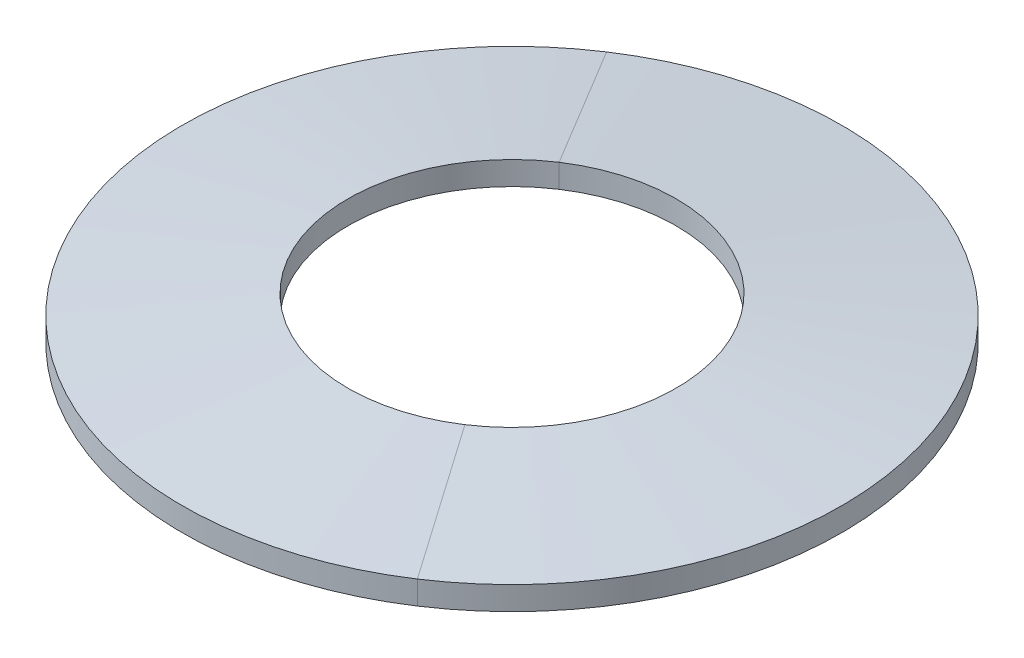
ISO-10303-21;
HEADER;
FILE_DESCRIPTION(('STEP AP214'),'2;1');
FILE_NAME('part.step','',(''),(''),'','','');
FILE_SCHEMA(('AUTOMOTIVE_DESIGN { 1 0 10303 214 1 1 1 1 }'));
ENDSEC;
DATA;
#1=APPLICATION_CONTEXT('core data for automotive mechanical design processes');
#2=APPLICATION_PROTOCOL_DEFINITION('international standard','automotive_design',2000,#1);
#3=PRODUCT_CONTEXT('',#1,'mechanical');
#4=PRODUCT('Part','Part','',(#3));
#5=PRODUCT_RELATED_PRODUCT_CATEGORY('part','',(#4));
#6=PRODUCT_DEFINITION_FORMATION('','',#4);
#7=PRODUCT_DEFINITION_CONTEXT('part definition',#1,'design');
#8=PRODUCT_DEFINITION('design','',#6,#7);
#9=PRODUCT_DEFINITION_SHAPE('','',#8);
#10=(LENGTH_UNIT() NAMED_UNIT(*) SI_UNIT(.MILLI.,.METRE.));
#11=(NAMED_UNIT(*) PLANE_ANGLE_UNIT() SI_UNIT($,.RADIAN.));
#12=(NAMED_UNIT(*) SI_UNIT($,.STERADIAN.) SOLID_ANGLE_UNIT());
#13=UNCERTAINTY_MEASURE_WITH_UNIT(LENGTH_MEASURE(1.E-05),#10,'distance_accuracy_value','');
#14=(GEOMETRIC_REPRESENTATION_CONTEXT(3) GLOBAL_UNCERTAINTY_ASSIGNED_CONTEXT((#13)) GLOBAL_UNIT_ASSIGNED_CONTEXT((#10,
#11,#12)) REPRESENTATION_CONTEXT('',''));
#15=CARTESIAN_POINT('',(0.,0.,0.));
#16=DIRECTION('',(0.,0.,1.));
#17=DIRECTION('',(1.,0.,0.));
#18=AXIS2_PLACEMENT_3D('',#15,#16,#17);
#19=CARTESIAN_POINT('',(-2.90698826646719,13.23693997096,54.127124258992));
#20=DIRECTION('',(0.,-1.,0.));
#21=DIRECTION('',(0.548877789893739,0.,0.835902609016962));
#22=AXIS2_PLACEMENT_3D('',#19,#20,#21);
#23=CONICAL_SURFACE('',#22,5.6,1.4562556283342);
#24=DIRECTION('',(0.545281203984704,-0.114290406899663,0.830425259413333));
#25=VECTOR('',#24,1.);
#26=CARTESIAN_POINT('',(0.166727356937746,13.23693997096,58.808178869487));
#27=LINE('',#26,#25);
#28=CARTESIAN_POINT('',(0.166727356937746,13.23693997096,58.808178869487));
#29=VERTEX_POINT('',#28);
#30=CARTESIAN_POINT('',(3.26788686983737,12.58693997096,63.5310286104329));
#31=VERTEX_POINT('',#30);
#32=EDGE_CURVE('E315',#29,#31,#27,.T.);
#33=ORIENTED_EDGE('',*,*,#32,.F.);
#34=CARTESIAN_POINT('',(-2.90698826646719,13.23693997096,54.127124258992));
#35=DIRECTION('',(0.,-1.,0.));
#36=DIRECTION('',(-0.548877789893739,0.,-0.835902609016962));
#37=AXIS2_PLACEMENT_3D('',#34,#35,#36);
#38=CIRCLE('',#37,5.6);
#39=CARTESIAN_POINT('',(-5.98070388987213,13.23693997096,49.4460696484971));
#40=VERTEX_POINT('',#39);
#41=EDGE_CURVE('E73',#29,#40,#38,.T.);
#42=ORIENTED_EDGE('',*,*,#41,.T.);
#43=DIRECTION('',(-0.545281203984704,-0.114290406899663,-0.830425259413333));
#44=VECTOR('',#43,1.);
#45=CARTESIAN_POINT('',(-5.98070388987213,13.23693997096,49.4460696484971));
#46=LINE('',#45,#44);
#47=CARTESIAN_POINT('',(-9.08186340277176,12.58693997096,44.7232199075512));
#48=VERTEX_POINT('',#47);
#49=EDGE_CURVE('E99',#40,#48,#46,.T.);
#50=ORIENTED_EDGE('',*,*,#49,.T.);
#51=CARTESIAN_POINT('',(-2.90698826646719,12.58693997096,54.127124258992));
#52=DIRECTION('',(0.,-1.,0.));
#53=DIRECTION('',(-0.548877789893739,0.,-0.835902609016962));
#54=AXIS2_PLACEMENT_3D('',#51,#52,#53);
#55=CIRCLE('',#54,11.25);
#56=EDGE_CURVE('E11',#31,#48,#55,.T.);
#57=ORIENTED_EDGE('',*,*,#56,.F.);
#58=EDGE_LOOP('',(#33,#42,#50,#57));
#59=FACE_BOUND('',#58,.T.);
#60=ADVANCED_FACE('F17',(#59),#23,.T.);
#61=CARTESIAN_POINT('',(-2.90698826646719,11.78693997096,54.127124258992));
#62=DIRECTION('',(0.,-1.,0.));
#63=DIRECTION('',(0.548877789893739,0.,0.835902609016962));
#64=AXIS2_PLACEMENT_3D('',#61,#62,#63);
#65=CYLINDRICAL_SURFACE('',#64,11.25);
#66=DIRECTION('',(0.,-1.,0.));
#67=VECTOR('',#66,1.);
#68=CARTESIAN_POINT('',(3.26788686983737,11.78693997096,63.5310286104329));
#69=LINE('',#68,#67);
#70=CARTESIAN_POINT('',(3.26788686983737,11.78693997096,63.5310286104329));
#71=VERTEX_POINT('',#70);
#72=EDGE_CURVE('E93',#31,#71,#69,.T.);
#73=ORIENTED_EDGE('',*,*,#72,.F.);
#74=ORIENTED_EDGE('',*,*,#56,.T.);
#75=DIRECTION('',(0.,-1.,0.));
#76=VECTOR('',#75,1.);
#77=CARTESIAN_POINT('',(-9.08186340277176,11.78693997096,44.7232199075512));
#78=LINE('',#77,#76);
#79=CARTESIAN_POINT('',(-9.08186340277176,11.78693997096,44.7232199075512));
#80=VERTEX_POINT('',#79);
#81=EDGE_CURVE('E84',#48,#80,#78,.T.);
#82=ORIENTED_EDGE('',*,*,#81,.T.);
#83=CARTESIAN_POINT('',(-2.90698826646719,11.78693997096,54.127124258992));
#84=DIRECTION('',(0.,-1.,0.));
#85=DIRECTION('',(-0.548877789893739,0.,-0.835902609016962));
#86=AXIS2_PLACEMENT_3D('',#83,#84,#85);
#87=CIRCLE('',#86,11.25);
#88=EDGE_CURVE('E74',#71,#80,#87,.T.);
#89=ORIENTED_EDGE('',*,*,#88,.F.);
#90=EDGE_LOOP('',(#73,#74,#82,#89));
#91=FACE_BOUND('',#90,.T.);
#92=ADVANCED_FACE('F85',(#91),#65,.T.);
#93=CARTESIAN_POINT('',(-2.90698826646719,11.78693997096,54.127124258992));
#94=DIRECTION('',(0.,-1.,0.));
#95=DIRECTION('',(0.54887778989374,0.,0.835902609016962));
#96=AXIS2_PLACEMENT_3D('',#93,#94,#95);
#97=CONICAL_SURFACE('',#96,11.25,1.4562556283342);
#98=DIRECTION('',(0.545281203984704,-0.114290406899663,0.830425259413333));
#99=VECTOR('',#98,1.);
#100=CARTESIAN_POINT('',(3.26788686983737,11.78693997096,63.5310286104329));
#101=LINE('',#100,#99);
#102=CARTESIAN_POINT('',(0.166727356937746,12.43693997096,58.808178869487));
#103=VERTEX_POINT('',#102);
#104=EDGE_CURVE('E79',#103,#71,#101,.T.);
#105=ORIENTED_EDGE('',*,*,#104,.F.);
#106=CARTESIAN_POINT('',(-2.90698826646719,12.43693997096,54.127124258992));
#107=DIRECTION('',(0.,-1.,0.));
#108=DIRECTION('',(-0.548877789893739,0.,-0.835902609016962));
#109=AXIS2_PLACEMENT_3D('',#106,#107,#108);
#110=CIRCLE('',#109,5.6);
#111=CARTESIAN_POINT('',(-5.98070388987213,12.43693997096,49.4460696484971));
#112=VERTEX_POINT('',#111);
#113=EDGE_CURVE('E26',#112,#103,#110,.T.);
#114=ORIENTED_EDGE('',*,*,#113,.F.);
#115=DIRECTION('',(-0.545281203984704,-0.114290406899663,-0.830425259413333));
#116=VECTOR('',#115,1.);
#117=CARTESIAN_POINT('',(-9.08186340277176,11.78693997096,44.7232199075512));
#118=LINE('',#117,#116);
#119=EDGE_CURVE('E63',#112,#80,#118,.T.);
#120=ORIENTED_EDGE('',*,*,#119,.T.);
#121=CARTESIAN_POINT('',(-2.90698826646719,11.78693997096,54.127124258992));
#122=DIRECTION('',(0.,-1.,0.));
#123=DIRECTION('',(-0.548877789893739,0.,-0.835902609016962));
#124=AXIS2_PLACEMENT_3D('',#121,#122,#123);
#125=CIRCLE('',#124,11.25);
#126=EDGE_CURVE('E67',#80,#71,#125,.T.);
#127=ORIENTED_EDGE('',*,*,#126,.T.);
#128=EDGE_LOOP('',(#105,#114,#120,#127));
#129=FACE_BOUND('',#128,.T.);
#130=ADVANCED_FACE('F65',(#129),#97,.F.);
#131=CARTESIAN_POINT('',(-2.90698826646719,11.78693997096,54.127124258992));
#132=DIRECTION('',(0.,-1.,0.));
#133=DIRECTION('',(0.548877789893739,0.,0.835902609016962));
#134=AXIS2_PLACEMENT_3D('',#131,#132,#133);
#135=CYLINDRICAL_SURFACE('',#134,5.6);
#136=DIRECTION('',(0.,-1.,0.));
#137=VECTOR('',#136,1.);
#138=CARTESIAN_POINT('',(0.166727356937746,11.78693997096,58.808178869487));
#139=LINE('',#138,#137);
#140=EDGE_CURVE('E108',#29,#103,#139,.T.);
#141=ORIENTED_EDGE('',*,*,#140,.F.);
#142=CARTESIAN_POINT('',(-2.90698826646719,13.23693997096,54.127124258992));
#143=DIRECTION('',(0.,-1.,0.));
#144=DIRECTION('',(-0.548877789893739,0.,-0.835902609016962));
#145=AXIS2_PLACEMENT_3D('',#142,#143,#144);
#146=CIRCLE('',#145,5.6);
#147=EDGE_CURVE('E322',#40,#29,#146,.T.);
#148=ORIENTED_EDGE('',*,*,#147,.F.);
#149=DIRECTION('',(0.,-1.,0.));
#150=VECTOR('',#149,1.);
#151=CARTESIAN_POINT('',(-5.98070388987213,11.78693997096,49.4460696484971));
#152=LINE('',#151,#150);
#153=EDGE_CURVE('E103',#40,#112,#152,.T.);
#154=ORIENTED_EDGE('',*,*,#153,.T.);
#155=ORIENTED_EDGE('',*,*,#113,.T.);
#156=EDGE_LOOP('',(#141,#148,#154,#155));
#157=FACE_BOUND('',#156,.T.);
#158=ADVANCED_FACE('F151',(#157),#135,.F.);
#159=CARTESIAN_POINT('',(-2.90698826646719,11.78693997096,54.127124258992));
#160=DIRECTION('',(0.,-1.,0.));
#161=DIRECTION('',(0.548877789893739,0.,0.835902609016962));
#162=AXIS2_PLACEMENT_3D('',#159,#160,#161);
#163=CYLINDRICAL_SURFACE('',#162,5.6);
#164=ORIENTED_EDGE('',*,*,#41,.F.);
#165=ORIENTED_EDGE('',*,*,#140,.T.);
#166=CARTESIAN_POINT('',(-2.90698826646719,12.43693997096,54.127124258992));
#167=DIRECTION('',(0.,-1.,0.));
#168=DIRECTION('',(-0.548877789893739,0.,-0.835902609016962));
#169=AXIS2_PLACEMENT_3D('',#166,#167,#168);
#170=CIRCLE('',#169,5.6);
#171=EDGE_CURVE('E90',#103,#112,#170,.T.);
#172=ORIENTED_EDGE('',*,*,#171,.T.);
#173=ORIENTED_EDGE('',*,*,#153,.F.);
#174=EDGE_LOOP('',(#164,#165,#172,#173));
#175=FACE_BOUND('',#174,.T.);
#176=ADVANCED_FACE('F161',(#175),#163,.F.);
#177=CARTESIAN_POINT('',(-2.90698826646719,11.78693997096,54.127124258992));
#178=DIRECTION('',(0.,-1.,0.));
#179=DIRECTION('',(0.54887778989374,0.,0.835902609016962));
#180=AXIS2_PLACEMENT_3D('',#177,#178,#179);
#181=CONICAL_SURFACE('',#180,11.25,1.4562556283342);
#182=ORIENTED_EDGE('',*,*,#171,.F.);
#183=ORIENTED_EDGE('',*,*,#104,.T.);
#184=ORIENTED_EDGE('',*,*,#88,.T.);
#185=ORIENTED_EDGE('',*,*,#119,.F.);
#186=EDGE_LOOP('',(#182,#183,#184,#185));
#187=FACE_BOUND('',#186,.T.);
#188=ADVANCED_FACE('F78',(#187),#181,.F.);
#189=CARTESIAN_POINT('',(-2.90698826646719,11.78693997096,54.127124258992));
#190=DIRECTION('',(0.,-1.,0.));
#191=DIRECTION('',(0.548877789893739,0.,0.835902609016962));
#192=AXIS2_PLACEMENT_3D('',#189,#190,#191);
#193=CYLINDRICAL_SURFACE('',#192,11.25);
#194=CARTESIAN_POINT('',(-2.90698826646719,12.58693997096,54.127124258992));
#195=DIRECTION('',(0.,-1.,0.));
#196=DIRECTION('',(-0.548877789893739,0.,-0.835902609016962));
#197=AXIS2_PLACEMENT_3D('',#194,#195,#196);
#198=CIRCLE('',#197,11.25);
#199=EDGE_CURVE('E321',#48,#31,#198,.T.);
#200=ORIENTED_EDGE('',*,*,#199,.T.);
#201=ORIENTED_EDGE('',*,*,#72,.T.);
#202=ORIENTED_EDGE('',*,*,#126,.F.);
#203=ORIENTED_EDGE('',*,*,#81,.F.);
#204=EDGE_LOOP('',(#200,#201,#202,#203));
#205=FACE_BOUND('',#204,.T.);
#206=ADVANCED_FACE('F92',(#205),#193,.T.);
#207=CARTESIAN_POINT('',(-2.90698826646719,13.23693997096,54.127124258992));
#208=DIRECTION('',(0.,-1.,0.));
#209=DIRECTION('',(0.548877789893739,0.,0.835902609016962));
#210=AXIS2_PLACEMENT_3D('',#207,#208,#209);
#211=CONICAL_SURFACE('',#210,5.6,1.4562556283342);
#212=ORIENTED_EDGE('',*,*,#147,.T.);
#213=ORIENTED_EDGE('',*,*,#32,.T.);
#214=ORIENTED_EDGE('',*,*,#199,.F.);
#215=ORIENTED_EDGE('',*,*,#49,.F.);
#216=EDGE_LOOP('',(#212,#213,#214,#215));
#217=FACE_BOUND('',#216,.T.);
#218=ADVANCED_FACE('F119',(#217),#211,.T.);
#219=CLOSED_SHELL('',(#60,#92,#130,#158,#176,#188,#206,#218));
#220=MANIFOLD_SOLID_BREP('B1',#219);
#221=ADVANCED_BREP_SHAPE_REPRESENTATION('',(#18,#220),#14);
#222=SHAPE_DEFINITION_REPRESENTATION(#9,#221);
ENDSEC;
END-ISO-10303-21;
